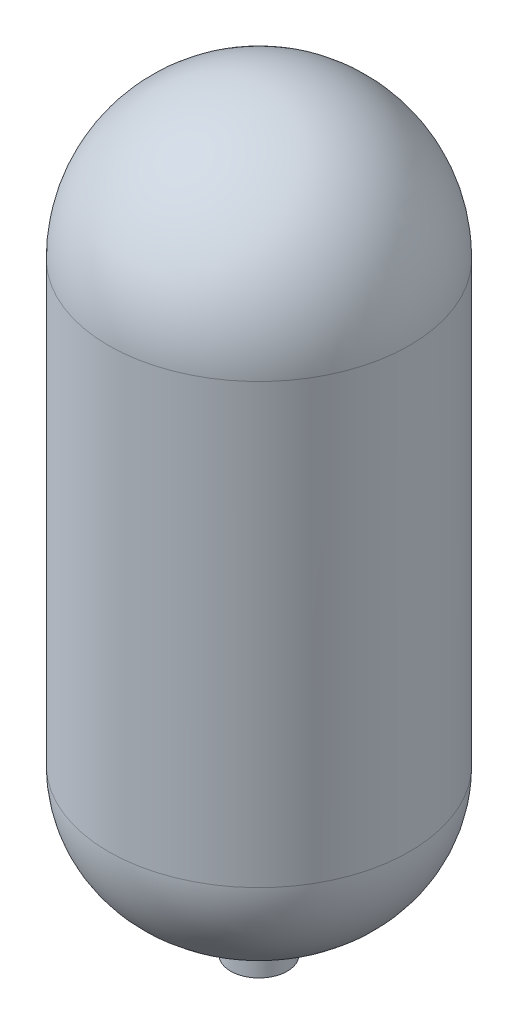
ISO-10303-21;
HEADER;
FILE_DESCRIPTION(('STEP AP214'),'2;1');
FILE_NAME('part.step','',(''),(''),'','','');
FILE_SCHEMA(('AUTOMOTIVE_DESIGN { 1 0 10303 214 1 1 1 1 }'));
ENDSEC;
DATA;
#1=APPLICATION_CONTEXT('core data for automotive mechanical design processes');
#2=APPLICATION_PROTOCOL_DEFINITION('international standard','automotive_design',2000,#1);
#3=PRODUCT_CONTEXT('',#1,'mechanical');
#4=PRODUCT('Part','Part','',(#3));
#5=PRODUCT_RELATED_PRODUCT_CATEGORY('part','',(#4));
#6=PRODUCT_DEFINITION_FORMATION('','',#4);
#7=PRODUCT_DEFINITION_CONTEXT('part definition',#1,'design');
#8=PRODUCT_DEFINITION('design','',#6,#7);
#9=PRODUCT_DEFINITION_SHAPE('','',#8);
#10=(LENGTH_UNIT() NAMED_UNIT(*) SI_UNIT(.MILLI.,.METRE.));
#11=(NAMED_UNIT(*) PLANE_ANGLE_UNIT() SI_UNIT($,.RADIAN.));
#12=(NAMED_UNIT(*) SI_UNIT($,.STERADIAN.) SOLID_ANGLE_UNIT());
#13=UNCERTAINTY_MEASURE_WITH_UNIT(LENGTH_MEASURE(1.E-05),#10,'distance_accuracy_value','');
#14=(GEOMETRIC_REPRESENTATION_CONTEXT(3) GLOBAL_UNCERTAINTY_ASSIGNED_CONTEXT((#13)) GLOBAL_UNIT_ASSIGNED_CONTEXT((#10,
#11,#12)) REPRESENTATION_CONTEXT('',''));
#15=CARTESIAN_POINT('',(0.,0.,0.));
#16=DIRECTION('',(0.,0.,1.));
#17=DIRECTION('',(1.,0.,0.));
#18=AXIS2_PLACEMENT_3D('',#15,#16,#17);
#19=CARTESIAN_POINT('',(0.,101.5,0.));
#20=DIRECTION('',(0.,1.,0.));
#21=DIRECTION('',(1.,0.,0.));
#22=AXIS2_PLACEMENT_3D('',#19,#20,#21);
#23=SPHERICAL_SURFACE('',#22,67.5);
#24=CARTESIAN_POINT('',(0.,101.5,0.));
#25=DIRECTION('',(0.,1.,0.));
#26=DIRECTION('',(0.,0.,1.));
#27=AXIS2_PLACEMENT_3D('',#24,#25,#26);
#28=CIRCLE('',#27,67.5);
#29=CARTESIAN_POINT('',(0.,101.5,67.5));
#30=VERTEX_POINT('',#29);
#31=EDGE_CURVE('E10',#30,#30,#28,.T.);
#32=ORIENTED_EDGE('',*,*,#31,.T.);
#33=EDGE_LOOP('',(#32));
#34=FACE_BOUND('',#33,.T.);
#35=ADVANCED_FACE('F33',(#34),#23,.T.);
#36=CARTESIAN_POINT('',(0.,169.,0.));
#37=DIRECTION('',(0.,1.,0.));
#38=DIRECTION('',(0.,0.,1.));
#39=AXIS2_PLACEMENT_3D('',#36,#37,#38);
#40=CYLINDRICAL_SURFACE('',#39,67.5);
#41=CARTESIAN_POINT('',(0.,-95.15,0.));
#42=DIRECTION('',(0.,1.,0.));
#43=DIRECTION('',(0.,0.,1.));
#44=AXIS2_PLACEMENT_3D('',#41,#42,#43);
#45=CIRCLE('',#44,67.5);
#46=CARTESIAN_POINT('',(0.,-95.15,67.5));
#47=VERTEX_POINT('',#46);
#48=EDGE_CURVE('E39',#47,#47,#45,.T.);
#49=ORIENTED_EDGE('',*,*,#48,.T.);
#50=EDGE_LOOP('',(#49));
#51=FACE_BOUND('',#50,.T.);
#52=ORIENTED_EDGE('',*,*,#31,.F.);
#53=EDGE_LOOP('',(#52));
#54=FACE_BOUND('',#53,.T.);
#55=ADVANCED_FACE('F82',(#51,#54),#40,.T.);
#56=CARTESIAN_POINT('',(0.,-95.15,0.));
#57=DIRECTION('',(0.,1.,0.));
#58=DIRECTION('',(0.,0.,1.));
#59=AXIS2_PLACEMENT_3D('',#56,#57,#58);
#60=DEGENERATE_TOROIDAL_SURFACE('',#59,12.7,54.8,.T.);
#61=CARTESIAN_POINT('',(0.,-149.95,0.));
#62=DIRECTION('',(0.,1.,0.));
#63=DIRECTION('',(0.,0.,1.));
#64=AXIS2_PLACEMENT_3D('',#61,#62,#63);
#65=CIRCLE('',#64,12.7);
#66=CARTESIAN_POINT('',(0.,-149.95,12.7));
#67=VERTEX_POINT('',#66);
#68=EDGE_CURVE('E43',#67,#67,#65,.T.);
#69=ORIENTED_EDGE('',*,*,#68,.T.);
#70=EDGE_LOOP('',(#69));
#71=FACE_BOUND('',#70,.T.);
#72=ORIENTED_EDGE('',*,*,#48,.F.);
#73=EDGE_LOOP('',(#72));
#74=FACE_BOUND('',#73,.T.);
#75=ADVANCED_FACE('F86',(#71,#74),#60,.T.);
#76=CARTESIAN_POINT('',(0.,169.,0.));
#77=DIRECTION('',(0.,1.,0.));
#78=DIRECTION('',(0.,0.,1.));
#79=AXIS2_PLACEMENT_3D('',#76,#77,#78);
#80=CYLINDRICAL_SURFACE('',#79,12.7);
#81=CARTESIAN_POINT('',(0.,-169.,0.));
#82=DIRECTION('',(0.,1.,0.));
#83=DIRECTION('',(0.,0.,1.));
#84=AXIS2_PLACEMENT_3D('',#81,#82,#83);
#85=CIRCLE('',#84,12.7);
#86=CARTESIAN_POINT('',(0.,-169.,12.7));
#87=VERTEX_POINT('',#86);
#88=EDGE_CURVE('E47',#87,#87,#85,.T.);
#89=ORIENTED_EDGE('',*,*,#88,.T.);
#90=EDGE_LOOP('',(#89));
#91=FACE_BOUND('',#90,.T.);
#92=ORIENTED_EDGE('',*,*,#68,.F.);
#93=EDGE_LOOP('',(#92));
#94=FACE_BOUND('',#93,.T.);
#95=ADVANCED_FACE('F78',(#91,#94),#80,.T.);
#96=CARTESIAN_POINT('',(0.,-169.,0.));
#97=DIRECTION('',(0.,-1.,0.));
#98=DIRECTION('',(0.,0.,-1.));
#99=AXIS2_PLACEMENT_3D('',#96,#97,#98);
#100=PLANE('',#99);
#101=CARTESIAN_POINT('',(0.,-169.,0.));
#102=DIRECTION('',(0.,-1.,0.));
#103=DIRECTION('',(0.,0.,-1.));
#104=AXIS2_PLACEMENT_3D('',#101,#102,#103);
#105=CIRCLE('',#104,9.525);
#106=CARTESIAN_POINT('',(0.,-169.,-9.525));
#107=VERTEX_POINT('',#106);
#108=EDGE_CURVE('E53',#107,#107,#105,.F.);
#109=ORIENTED_EDGE('',*,*,#108,.T.);
#110=EDGE_LOOP('',(#109));
#111=FACE_BOUND('',#110,.T.);
#112=ORIENTED_EDGE('',*,*,#88,.F.);
#113=EDGE_LOOP('',(#112));
#114=FACE_BOUND('',#113,.T.);
#115=ADVANCED_FACE('F69',(#111,#114),#100,.T.);
#116=CARTESIAN_POINT('',(0.,101.5,0.));
#117=DIRECTION('',(0.,1.,0.));
#118=DIRECTION('',(1.,0.,0.));
#119=AXIS2_PLACEMENT_3D('',#116,#117,#118);
#120=SPHERICAL_SURFACE('',#119,64.325);
#121=CARTESIAN_POINT('',(0.,101.5,0.));
#122=DIRECTION('',(0.,1.,0.));
#123=DIRECTION('',(0.,0.,1.));
#124=AXIS2_PLACEMENT_3D('',#121,#122,#123);
#125=CIRCLE('',#124,64.325);
#126=CARTESIAN_POINT('',(0.,101.5,64.325));
#127=VERTEX_POINT('',#126);
#128=EDGE_CURVE('E52',#127,#127,#125,.T.);
#129=ORIENTED_EDGE('',*,*,#128,.F.);
#130=EDGE_LOOP('',(#129));
#131=FACE_BOUND('',#130,.T.);
#132=ADVANCED_FACE('F67',(#131),#120,.F.);
#133=CARTESIAN_POINT('',(0.,169.,0.));
#134=DIRECTION('',(0.,1.,0.));
#135=DIRECTION('',(0.,0.,1.));
#136=AXIS2_PLACEMENT_3D('',#133,#134,#135);
#137=CYLINDRICAL_SURFACE('',#136,64.325);
#138=CARTESIAN_POINT('',(0.,-95.15,0.));
#139=DIRECTION('',(0.,1.,0.));
#140=DIRECTION('',(0.,0.,1.));
#141=AXIS2_PLACEMENT_3D('',#138,#139,#140);
#142=CIRCLE('',#141,64.325);
#143=CARTESIAN_POINT('',(0.,-95.15,64.325));
#144=VERTEX_POINT('',#143);
#145=EDGE_CURVE('E59',#144,#144,#142,.T.);
#146=ORIENTED_EDGE('',*,*,#145,.F.);
#147=EDGE_LOOP('',(#146));
#148=FACE_BOUND('',#147,.T.);
#149=ORIENTED_EDGE('',*,*,#128,.T.);
#150=EDGE_LOOP('',(#149));
#151=FACE_BOUND('',#150,.T.);
#152=ADVANCED_FACE('F65',(#148,#151),#137,.F.);
#153=CARTESIAN_POINT('',(0.,-95.15,0.));
#154=DIRECTION('',(0.,1.,0.));
#155=DIRECTION('',(0.,0.,1.));
#156=AXIS2_PLACEMENT_3D('',#153,#154,#155);
#157=DEGENERATE_TOROIDAL_SURFACE('',#156,12.7,51.625,.T.);
#158=CARTESIAN_POINT('',(0.,-146.677274331173,0.));
#159=DIRECTION('',(0.,1.,0.));
#160=DIRECTION('',(0.,0.,1.));
#161=AXIS2_PLACEMENT_3D('',#158,#159,#160);
#162=CIRCLE('',#161,9.525);
#163=CARTESIAN_POINT('',(0.,-146.677274331173,9.525));
#164=VERTEX_POINT('',#163);
#165=EDGE_CURVE('E56',#164,#164,#162,.T.);
#166=ORIENTED_EDGE('',*,*,#165,.F.);
#167=EDGE_LOOP('',(#166));
#168=FACE_BOUND('',#167,.T.);
#169=ORIENTED_EDGE('',*,*,#145,.T.);
#170=EDGE_LOOP('',(#169));
#171=FACE_BOUND('',#170,.T.);
#172=ADVANCED_FACE('F75',(#168,#171),#157,.F.);
#173=CARTESIAN_POINT('',(0.,169.,0.));
#174=DIRECTION('',(0.,1.,0.));
#175=DIRECTION('',(0.,0.,1.));
#176=AXIS2_PLACEMENT_3D('',#173,#174,#175);
#177=CYLINDRICAL_SURFACE('',#176,9.525);
#178=ORIENTED_EDGE('',*,*,#108,.F.);
#179=EDGE_LOOP('',(#178));
#180=FACE_BOUND('',#179,.T.);
#181=ORIENTED_EDGE('',*,*,#165,.T.);
#182=EDGE_LOOP('',(#181));
#183=FACE_BOUND('',#182,.T.);
#184=ADVANCED_FACE('F97',(#180,#183),#177,.F.);
#185=CLOSED_SHELL('',(#35,#55,#75,#95,#115,#132,#152,#172,#184));
#186=MANIFOLD_SOLID_BREP('B2',#185);
#187=ADVANCED_BREP_SHAPE_REPRESENTATION('',(#18,#186),#14);
#188=SHAPE_DEFINITION_REPRESENTATION(#9,#187);
ENDSEC;
END-ISO-10303-21;
